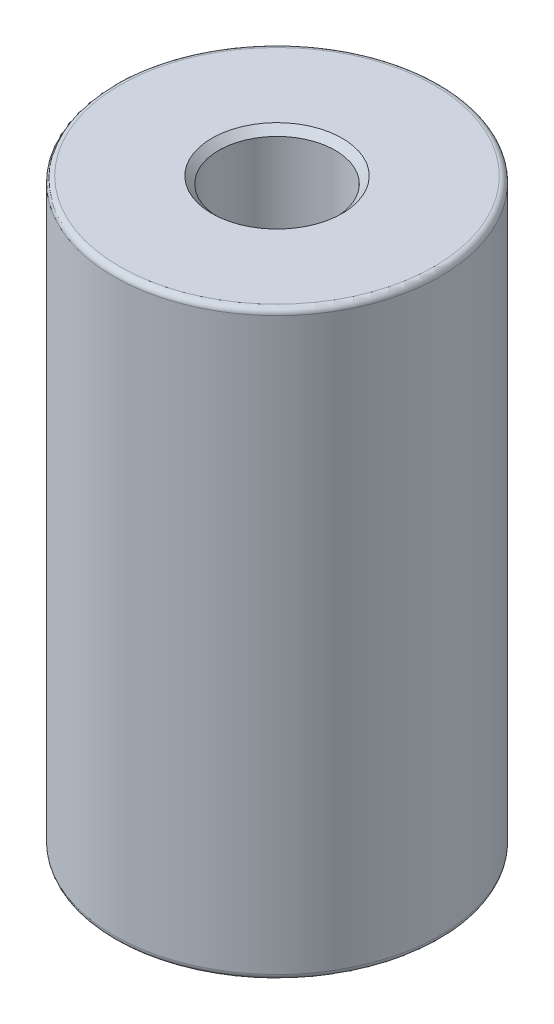
ISO-10303-21;
HEADER;
FILE_DESCRIPTION(('STEP AP214'),'2;1');
FILE_NAME('part.step','',(''),(''),'','','');
FILE_SCHEMA(('AUTOMOTIVE_DESIGN { 1 0 10303 214 1 1 1 1 }'));
ENDSEC;
DATA;
#1=APPLICATION_CONTEXT('core data for automotive mechanical design processes');
#2=APPLICATION_PROTOCOL_DEFINITION('international standard','automotive_design',2000,#1);
#3=PRODUCT_CONTEXT('',#1,'mechanical');
#4=PRODUCT('Part','Part','',(#3));
#5=PRODUCT_RELATED_PRODUCT_CATEGORY('part','',(#4));
#6=PRODUCT_DEFINITION_FORMATION('','',#4);
#7=PRODUCT_DEFINITION_CONTEXT('part definition',#1,'design');
#8=PRODUCT_DEFINITION('design','',#6,#7);
#9=PRODUCT_DEFINITION_SHAPE('','',#8);
#10=(LENGTH_UNIT() NAMED_UNIT(*) SI_UNIT(.MILLI.,.METRE.));
#11=(NAMED_UNIT(*) PLANE_ANGLE_UNIT() SI_UNIT($,.RADIAN.));
#12=(NAMED_UNIT(*) SI_UNIT($,.STERADIAN.) SOLID_ANGLE_UNIT());
#13=UNCERTAINTY_MEASURE_WITH_UNIT(LENGTH_MEASURE(1.E-05),#10,'distance_accuracy_value','');
#14=(GEOMETRIC_REPRESENTATION_CONTEXT(3) GLOBAL_UNCERTAINTY_ASSIGNED_CONTEXT((#13)) GLOBAL_UNIT_ASSIGNED_CONTEXT((#10,
#11,#12)) REPRESENTATION_CONTEXT('',''));
#15=CARTESIAN_POINT('',(0.,0.,0.));
#16=DIRECTION('',(0.,0.,1.));
#17=DIRECTION('',(1.,0.,0.));
#18=AXIS2_PLACEMENT_3D('',#15,#16,#17);
#19=CARTESIAN_POINT('',(0.,25.,0.));
#20=DIRECTION('',(0.,-1.,0.));
#21=DIRECTION('',(0.,0.,-1.));
#22=AXIS2_PLACEMENT_3D('',#19,#20,#21);
#23=CYLINDRICAL_SURFACE('',#22,7.);
#24=CARTESIAN_POINT('',(0.,0.25,0.));
#25=DIRECTION('',(0.,1.,0.));
#26=DIRECTION('',(0.,0.,1.));
#27=AXIS2_PLACEMENT_3D('',#24,#25,#26);
#28=CIRCLE('',#27,7.);
#29=CARTESIAN_POINT('',(0.,0.25,7.));
#30=VERTEX_POINT('',#29);
#31=EDGE_CURVE('E66',#30,#30,#28,.T.);
#32=ORIENTED_EDGE('',*,*,#31,.T.);
#33=EDGE_LOOP('',(#32));
#34=FACE_BOUND('',#33,.T.);
#35=CARTESIAN_POINT('',(0.,24.75,0.));
#36=DIRECTION('',(0.,1.,0.));
#37=DIRECTION('',(0.,0.,1.));
#38=AXIS2_PLACEMENT_3D('',#35,#36,#37);
#39=CIRCLE('',#38,7.);
#40=CARTESIAN_POINT('',(0.,24.75,7.));
#41=VERTEX_POINT('',#40);
#42=EDGE_CURVE('E69',#41,#41,#39,.F.);
#43=ORIENTED_EDGE('',*,*,#42,.T.);
#44=EDGE_LOOP('',(#43));
#45=FACE_BOUND('',#44,.T.);
#46=ADVANCED_FACE('F39',(#34,#45),#23,.T.);
#47=CARTESIAN_POINT('',(0.,25.,0.));
#48=DIRECTION('',(0.,1.,0.));
#49=DIRECTION('',(0.,0.,1.));
#50=AXIS2_PLACEMENT_3D('',#47,#48,#49);
#51=PLANE('',#50);
#52=CARTESIAN_POINT('',(0.,25.,0.));
#53=DIRECTION('',(0.,1.,0.));
#54=DIRECTION('',(0.,0.,1.));
#55=AXIS2_PLACEMENT_3D('',#52,#53,#54);
#56=CIRCLE('',#55,2.8);
#57=CARTESIAN_POINT('',(0.,25.,2.8));
#58=VERTEX_POINT('',#57);
#59=EDGE_CURVE('E10',#58,#58,#56,.F.);
#60=ORIENTED_EDGE('',*,*,#59,.T.);
#61=EDGE_LOOP('',(#60));
#62=FACE_BOUND('',#61,.T.);
#63=CARTESIAN_POINT('',(0.,25.,0.));
#64=DIRECTION('',(0.,1.,0.));
#65=DIRECTION('',(0.,0.,1.));
#66=AXIS2_PLACEMENT_3D('',#63,#64,#65);
#67=CIRCLE('',#66,6.75);
#68=CARTESIAN_POINT('',(0.,25.,6.75));
#69=VERTEX_POINT('',#68);
#70=EDGE_CURVE('E60',#69,#69,#67,.T.);
#71=ORIENTED_EDGE('',*,*,#70,.T.);
#72=EDGE_LOOP('',(#71));
#73=FACE_BOUND('',#72,.T.);
#74=ADVANCED_FACE('F97',(#62,#73),#51,.T.);
#75=CARTESIAN_POINT('',(0.,0.,0.));
#76=DIRECTION('',(0.,1.,0.));
#77=DIRECTION('',(0.,0.,1.));
#78=AXIS2_PLACEMENT_3D('',#75,#76,#77);
#79=PLANE('',#78);
#80=CARTESIAN_POINT('',(0.,0.,0.));
#81=DIRECTION('',(0.,1.,0.));
#82=DIRECTION('',(0.,0.,1.));
#83=AXIS2_PLACEMENT_3D('',#80,#81,#82);
#84=CIRCLE('',#83,4.3);
#85=CARTESIAN_POINT('',(0.,0.,4.3));
#86=VERTEX_POINT('',#85);
#87=EDGE_CURVE('E55',#86,#86,#84,.T.);
#88=ORIENTED_EDGE('',*,*,#87,.T.);
#89=EDGE_LOOP('',(#88));
#90=FACE_BOUND('',#89,.T.);
#91=CARTESIAN_POINT('',(0.,0.,0.));
#92=DIRECTION('',(0.,1.,0.));
#93=DIRECTION('',(0.,0.,1.));
#94=AXIS2_PLACEMENT_3D('',#91,#92,#93);
#95=CIRCLE('',#94,6.75);
#96=CARTESIAN_POINT('',(0.,0.,6.75));
#97=VERTEX_POINT('',#96);
#98=EDGE_CURVE('E63',#97,#97,#95,.F.);
#99=ORIENTED_EDGE('',*,*,#98,.T.);
#100=EDGE_LOOP('',(#99));
#101=FACE_BOUND('',#100,.T.);
#102=ADVANCED_FACE('F104',(#90,#101),#79,.F.);
#103=CARTESIAN_POINT('',(0.,15.,0.));
#104=DIRECTION('',(0.,1.,0.));
#105=DIRECTION('',(0.,0.,1.));
#106=AXIS2_PLACEMENT_3D('',#103,#104,#105);
#107=CYLINDRICAL_SURFACE('',#106,2.5);
#108=CARTESIAN_POINT('',(0.,24.7,0.));
#109=DIRECTION('',(0.,1.,0.));
#110=DIRECTION('',(0.,0.,1.));
#111=AXIS2_PLACEMENT_3D('',#108,#109,#110);
#112=CIRCLE('',#111,2.5);
#113=CARTESIAN_POINT('',(0.,24.7,2.5));
#114=VERTEX_POINT('',#113);
#115=EDGE_CURVE('E47',#114,#114,#112,.T.);
#116=ORIENTED_EDGE('',*,*,#115,.T.);
#117=EDGE_LOOP('',(#116));
#118=FACE_BOUND('',#117,.T.);
#119=CARTESIAN_POINT('',(0.,15.,0.));
#120=DIRECTION('',(0.,1.,0.));
#121=DIRECTION('',(0.,0.,1.));
#122=AXIS2_PLACEMENT_3D('',#119,#120,#121);
#123=CIRCLE('',#122,2.5);
#124=CARTESIAN_POINT('',(0.,15.,2.5));
#125=VERTEX_POINT('',#124);
#126=EDGE_CURVE('E72',#125,#125,#123,.T.);
#127=ORIENTED_EDGE('',*,*,#126,.F.);
#128=EDGE_LOOP('',(#127));
#129=FACE_BOUND('',#128,.T.);
#130=ADVANCED_FACE('F93',(#118,#129),#107,.F.);
#131=CARTESIAN_POINT('',(0.,15.,0.));
#132=DIRECTION('',(0.,-1.,0.));
#133=DIRECTION('',(0.,0.,-1.));
#134=AXIS2_PLACEMENT_3D('',#131,#132,#133);
#135=CYLINDRICAL_SURFACE('',#134,4.);
#136=CARTESIAN_POINT('',(0.,0.299999999999996,0.));
#137=DIRECTION('',(0.,1.,0.));
#138=DIRECTION('',(0.,0.,1.));
#139=AXIS2_PLACEMENT_3D('',#136,#137,#138);
#140=CIRCLE('',#139,4.);
#141=CARTESIAN_POINT('',(0.,0.299999999999996,4.));
#142=VERTEX_POINT('',#141);
#143=EDGE_CURVE('E51',#142,#142,#140,.F.);
#144=ORIENTED_EDGE('',*,*,#143,.T.);
#145=EDGE_LOOP('',(#144));
#146=FACE_BOUND('',#145,.T.);
#147=CARTESIAN_POINT('',(0.,15.,0.));
#148=DIRECTION('',(0.,1.,0.));
#149=DIRECTION('',(0.,0.,1.));
#150=AXIS2_PLACEMENT_3D('',#147,#148,#149);
#151=CIRCLE('',#150,4.);
#152=CARTESIAN_POINT('',(0.,15.,4.));
#153=VERTEX_POINT('',#152);
#154=EDGE_CURVE('E75',#153,#153,#151,.T.);
#155=ORIENTED_EDGE('',*,*,#154,.T.);
#156=EDGE_LOOP('',(#155));
#157=FACE_BOUND('',#156,.T.);
#158=ADVANCED_FACE('F79',(#146,#157),#135,.F.);
#159=CARTESIAN_POINT('',(0.,15.,0.));
#160=DIRECTION('',(0.,1.,0.));
#161=DIRECTION('',(0.,0.,1.));
#162=AXIS2_PLACEMENT_3D('',#159,#160,#161);
#163=PLANE('',#162);
#164=ORIENTED_EDGE('',*,*,#126,.T.);
#165=EDGE_LOOP('',(#164));
#166=FACE_BOUND('',#165,.T.);
#167=ORIENTED_EDGE('',*,*,#154,.F.);
#168=EDGE_LOOP('',(#167));
#169=FACE_BOUND('',#168,.T.);
#170=ADVANCED_FACE('F81',(#166,#169),#163,.F.);
#171=CARTESIAN_POINT('',(0.,0.25,0.));
#172=DIRECTION('',(0.,1.,0.));
#173=DIRECTION('',(0.,0.,1.));
#174=AXIS2_PLACEMENT_3D('',#171,#172,#173);
#175=TOROIDAL_SURFACE('',#174,6.75,0.25);
#176=ORIENTED_EDGE('',*,*,#98,.F.);
#177=EDGE_LOOP('',(#176));
#178=FACE_BOUND('',#177,.T.);
#179=ORIENTED_EDGE('',*,*,#31,.F.);
#180=EDGE_LOOP('',(#179));
#181=FACE_BOUND('',#180,.T.);
#182=ADVANCED_FACE('F83',(#178,#181),#175,.T.);
#183=CARTESIAN_POINT('',(0.,24.75,0.));
#184=DIRECTION('',(0.,1.,0.));
#185=DIRECTION('',(0.,0.,1.));
#186=AXIS2_PLACEMENT_3D('',#183,#184,#185);
#187=TOROIDAL_SURFACE('',#186,6.75,0.25);
#188=ORIENTED_EDGE('',*,*,#42,.F.);
#189=EDGE_LOOP('',(#188));
#190=FACE_BOUND('',#189,.T.);
#191=ORIENTED_EDGE('',*,*,#70,.F.);
#192=EDGE_LOOP('',(#191));
#193=FACE_BOUND('',#192,.T.);
#194=ADVANCED_FACE('F90',(#190,#193),#187,.T.);
#195=CARTESIAN_POINT('',(0.,0.,0.));
#196=DIRECTION('',(0.,-1.,0.));
#197=DIRECTION('',(0.,0.,-1.));
#198=AXIS2_PLACEMENT_3D('',#195,#196,#197);
#199=CONICAL_SURFACE('',#198,4.3,0.785398163397451);
#200=ORIENTED_EDGE('',*,*,#143,.F.);
#201=EDGE_LOOP('',(#200));
#202=FACE_BOUND('',#201,.T.);
#203=ORIENTED_EDGE('',*,*,#87,.F.);
#204=EDGE_LOOP('',(#203));
#205=FACE_BOUND('',#204,.T.);
#206=ADVANCED_FACE('F110',(#202,#205),#199,.F.);
#207=CARTESIAN_POINT('',(0.,24.7,0.));
#208=DIRECTION('',(0.,1.,0.));
#209=DIRECTION('',(0.,0.,1.));
#210=AXIS2_PLACEMENT_3D('',#207,#208,#209);
#211=CONICAL_SURFACE('',#210,2.5,0.785398163397446);
#212=ORIENTED_EDGE('',*,*,#59,.F.);
#213=EDGE_LOOP('',(#212));
#214=FACE_BOUND('',#213,.T.);
#215=ORIENTED_EDGE('',*,*,#115,.F.);
#216=EDGE_LOOP('',(#215));
#217=FACE_BOUND('',#216,.T.);
#218=ADVANCED_FACE('F42',(#214,#217),#211,.F.);
#219=CLOSED_SHELL('',(#46,#74,#102,#130,#158,#170,#182,#194,#206,#218));
#220=MANIFOLD_SOLID_BREP('B2',#219);
#221=ADVANCED_BREP_SHAPE_REPRESENTATION('',(#18,#220),#14);
#222=SHAPE_DEFINITION_REPRESENTATION(#9,#221);
ENDSEC;
END-ISO-10303-21;
